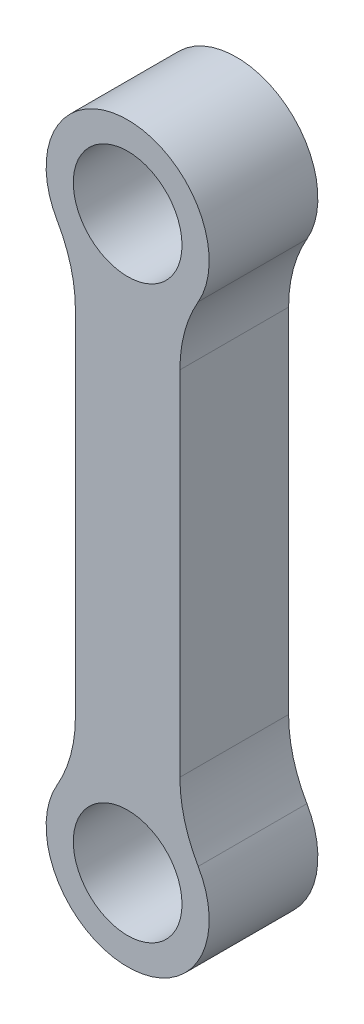
ISO-10303-21;
HEADER;
FILE_DESCRIPTION(('STEP AP214'),'2;1');
FILE_NAME('part.step','',(''),(''),'','','');
FILE_SCHEMA(('AUTOMOTIVE_DESIGN { 1 0 10303 214 1 1 1 1 }'));
ENDSEC;
DATA;
#1=APPLICATION_CONTEXT('core data for automotive mechanical design processes');
#2=APPLICATION_PROTOCOL_DEFINITION('international standard','automotive_design',2000,#1);
#3=PRODUCT_CONTEXT('',#1,'mechanical');
#4=PRODUCT('Part','Part','',(#3));
#5=PRODUCT_RELATED_PRODUCT_CATEGORY('part','',(#4));
#6=PRODUCT_DEFINITION_FORMATION('','',#4);
#7=PRODUCT_DEFINITION_CONTEXT('part definition',#1,'design');
#8=PRODUCT_DEFINITION('design','',#6,#7);
#9=PRODUCT_DEFINITION_SHAPE('','',#8);
#10=(LENGTH_UNIT() NAMED_UNIT(*) SI_UNIT(.MILLI.,.METRE.));
#11=(NAMED_UNIT(*) PLANE_ANGLE_UNIT() SI_UNIT($,.RADIAN.));
#12=(NAMED_UNIT(*) SI_UNIT($,.STERADIAN.) SOLID_ANGLE_UNIT());
#13=UNCERTAINTY_MEASURE_WITH_UNIT(LENGTH_MEASURE(1.E-05),#10,'distance_accuracy_value','');
#14=(GEOMETRIC_REPRESENTATION_CONTEXT(3) GLOBAL_UNCERTAINTY_ASSIGNED_CONTEXT((#13)) GLOBAL_UNIT_ASSIGNED_CONTEXT((#10,
#11,#12)) REPRESENTATION_CONTEXT('',''));
#15=CARTESIAN_POINT('',(0.,0.,0.));
#16=DIRECTION('',(0.,0.,1.));
#17=DIRECTION('',(1.,0.,0.));
#18=AXIS2_PLACEMENT_3D('',#15,#16,#17);
#19=CARTESIAN_POINT('',(0.,0.,0.));
#20=DIRECTION('',(0.,0.,0.999999999999994));
#21=DIRECTION('',(0.999999999999998,0.,0.));
#22=AXIS2_PLACEMENT_3D('',#19,#20,#21);
#23=CYLINDRICAL_SURFACE('',#22,2.);
#24=CARTESIAN_POINT('',(0.,0.,4.));
#25=DIRECTION('',(0.,0.,0.999999999999994));
#26=DIRECTION('',(0.999999999999998,0.,0.));
#27=AXIS2_PLACEMENT_3D('',#24,#25,#26);
#28=CIRCLE('',#27,2.);
#29=CARTESIAN_POINT('',(2.,0.,4.));
#30=VERTEX_POINT('',#29);
#31=EDGE_CURVE('E214',#30,#30,#28,.T.);
#32=CARTESIAN_POINT('',(0.,0.,0.5));
#33=DIRECTION('',(0.,0.,-0.999999999999994));
#34=DIRECTION('',(-0.999999999999998,0.,0.));
#35=AXIS2_PLACEMENT_3D('',#32,#33,#34);
#36=CIRCLE('',#35,2.);
#37=CARTESIAN_POINT('',(2.,0.,0.5));
#38=VERTEX_POINT('',#37);
#39=EDGE_CURVE('E11',#38,#38,#36,.F.);
#40=CARTESIAN_POINT('',(2.,0.,4.));
#41=CARTESIAN_POINT('',(2.,0.,3.96354166666666));
#42=CARTESIAN_POINT('',(2.,0.,3.92708333333333));
#43=CARTESIAN_POINT('',(2.,0.,3.85416666666666));
#44=CARTESIAN_POINT('',(2.,0.,3.81770833333333));
#45=CARTESIAN_POINT('',(2.,0.,3.74479166666666));
#46=CARTESIAN_POINT('',(2.,0.,3.70833333333333));
#47=CARTESIAN_POINT('',(2.,0.,3.63541666666666));
#48=CARTESIAN_POINT('',(2.,0.,3.59895833333333));
#49=CARTESIAN_POINT('',(2.,0.,3.52604166666666));
#50=CARTESIAN_POINT('',(2.,0.,3.48958333333333));
#51=CARTESIAN_POINT('',(2.,0.,3.41666666666666));
#52=CARTESIAN_POINT('',(2.,0.,3.38020833333333));
#53=CARTESIAN_POINT('',(2.,0.,3.30729166666666));
#54=CARTESIAN_POINT('',(2.,0.,3.27083333333333));
#55=CARTESIAN_POINT('',(2.,0.,3.19791666666666));
#56=CARTESIAN_POINT('',(2.,0.,3.16145833333333));
#57=CARTESIAN_POINT('',(2.,0.,3.08854166666666));
#58=CARTESIAN_POINT('',(2.,0.,3.05208333333333));
#59=CARTESIAN_POINT('',(2.,0.,2.97916666666666));
#60=CARTESIAN_POINT('',(2.,0.,2.94270833333333));
#61=CARTESIAN_POINT('',(2.,0.,2.86979166666666));
#62=CARTESIAN_POINT('',(2.,0.,2.83333333333333));
#63=CARTESIAN_POINT('',(2.,0.,2.76041666666666));
#64=CARTESIAN_POINT('',(2.,0.,2.72395833333333));
#65=CARTESIAN_POINT('',(2.,0.,2.65104166666666));
#66=CARTESIAN_POINT('',(2.,0.,2.61458333333333));
#67=CARTESIAN_POINT('',(2.,0.,2.54166666666666));
#68=CARTESIAN_POINT('',(2.,0.,2.50520833333333));
#69=CARTESIAN_POINT('',(2.,0.,2.43229166666666));
#70=CARTESIAN_POINT('',(2.,0.,2.39583333333333));
#71=CARTESIAN_POINT('',(2.,0.,2.32291666666667));
#72=CARTESIAN_POINT('',(2.,0.,2.28645833333333));
#73=CARTESIAN_POINT('',(2.,0.,2.21354166666666));
#74=CARTESIAN_POINT('',(2.,0.,2.17708333333333));
#75=CARTESIAN_POINT('',(2.,0.,2.10416666666667));
#76=CARTESIAN_POINT('',(2.,0.,2.06770833333333));
#77=CARTESIAN_POINT('',(2.,0.,1.99479166666667));
#78=CARTESIAN_POINT('',(2.,0.,1.95833333333333));
#79=CARTESIAN_POINT('',(2.,0.,1.88541666666667));
#80=CARTESIAN_POINT('',(2.,0.,1.84895833333333));
#81=CARTESIAN_POINT('',(2.,0.,1.77604166666667));
#82=CARTESIAN_POINT('',(2.,0.,1.73958333333333));
#83=CARTESIAN_POINT('',(2.,0.,1.66666666666667));
#84=CARTESIAN_POINT('',(2.,0.,1.63020833333333));
#85=CARTESIAN_POINT('',(2.,0.,1.55729166666667));
#86=CARTESIAN_POINT('',(2.,0.,1.52083333333333));
#87=CARTESIAN_POINT('',(2.,0.,1.44791666666667));
#88=CARTESIAN_POINT('',(2.,0.,1.41145833333333));
#89=CARTESIAN_POINT('',(2.,0.,1.33854166666667));
#90=CARTESIAN_POINT('',(2.,0.,1.30208333333333));
#91=CARTESIAN_POINT('',(2.,0.,1.22916666666667));
#92=CARTESIAN_POINT('',(2.,0.,1.19270833333333));
#93=CARTESIAN_POINT('',(2.,0.,1.11979166666667));
#94=CARTESIAN_POINT('',(2.,0.,1.08333333333333));
#95=CARTESIAN_POINT('',(2.,0.,1.01041666666667));
#96=CARTESIAN_POINT('',(2.,0.,0.973958333333333));
#97=CARTESIAN_POINT('',(2.,0.,0.901041666666666));
#98=CARTESIAN_POINT('',(2.,0.,0.864583333333333));
#99=CARTESIAN_POINT('',(2.,0.,0.791666666666667));
#100=CARTESIAN_POINT('',(2.,0.,0.755208333333333));
#101=CARTESIAN_POINT('',(2.,0.,0.682291666666667));
#102=CARTESIAN_POINT('',(2.,0.,0.645833333333333));
#103=CARTESIAN_POINT('',(2.,0.,0.572916666666667));
#104=CARTESIAN_POINT('',(2.,0.,0.536458333333333));
#105=CARTESIAN_POINT('',(2.,0.,0.5));
#106=B_SPLINE_CURVE_WITH_KNOTS('',3,(#40,#41,#42,#43,#44,#45,#46,#47,#48,#49,#50,#51,#52,#53,
#54,#55,#56,#57,#58,#59,#60,#61,#62,#63,#64,#65,#66,#67,#68,#69,#70,#71,#72,#73,#74,#75,#76,#77,
#78,#79,#80,#81,#82,#83,#84,#85,#86,#87,#88,#89,#90,#91,#92,#93,#94,#95,#96,#97,#98,#99,#100,
#101,#102,#103,#104,#105),.UNSPECIFIED.,.F.,.F.,(4,2,2,2,2,2,2,2,2,2,2,2,2,2,2,2,2,2,2,2,2,2,2,
2,2,2,2,2,2,2,2,2,4),(0.,0.109375,0.218749999999999,0.328124999999999,0.437499999999999,
0.546874999999999,0.656249999999999,0.765624999999999,0.874999999999999,0.984374999999998,
1.09375,1.203125,1.3125,1.421875,1.53125,1.640625,1.75,1.859375,1.96875,2.078125,2.1875,
2.296875,2.40625,2.515625,2.625,2.734375,2.84375,2.953125,3.0625,3.171875,3.28125,3.390625,3.5),.UNSPECIFIED.);
#107=EDGE_CURVE('BSEAM36',#30,#38,#106,.T.);
#108=ORIENTED_EDGE('',*,*,#31,.T.);
#109=ORIENTED_EDGE('',*,*,#39,.F.);
#110=ORIENTED_EDGE('',*,*,#107,.T.);
#111=ORIENTED_EDGE('',*,*,#107,.F.);
#112=EDGE_LOOP('',(#108,#110,#109,#111));
#113=FACE_BOUND('',#112,.T.);
#114=ADVANCED_FACE('F36',(#113),#23,.F.);
#115=CARTESIAN_POINT('',(0.,20.9999999999999,0.));
#116=DIRECTION('',(0.,0.,0.999999999999994));
#117=DIRECTION('',(0.999999999999998,0.,0.));
#118=AXIS2_PLACEMENT_3D('',#115,#116,#117);
#119=CYLINDRICAL_SURFACE('',#118,2.);
#120=CARTESIAN_POINT('',(0.,20.9999999999999,4.));
#121=DIRECTION('',(0.,0.,0.999999999999994));
#122=DIRECTION('',(0.999999999999998,0.,0.));
#123=AXIS2_PLACEMENT_3D('',#120,#121,#122);
#124=CIRCLE('',#123,2.);
#125=CARTESIAN_POINT('',(2.,20.9999999999999,4.));
#126=VERTEX_POINT('',#125);
#127=EDGE_CURVE('E230',#126,#126,#124,.T.);
#128=CARTESIAN_POINT('',(0.,20.9999999999999,0.5));
#129=DIRECTION('',(0.,0.,-0.999999999999994));
#130=DIRECTION('',(-0.999999999999998,0.,0.));
#131=AXIS2_PLACEMENT_3D('',#128,#129,#130);
#132=CIRCLE('',#131,2.);
#133=CARTESIAN_POINT('',(2.,20.9999999999999,0.5));
#134=VERTEX_POINT('',#133);
#135=EDGE_CURVE('E44',#134,#134,#132,.F.);
#136=CARTESIAN_POINT('',(2.,20.9999999999999,4.));
#137=CARTESIAN_POINT('',(2.,20.9999999999999,3.96354166666666));
#138=CARTESIAN_POINT('',(2.,20.9999999999999,3.92708333333333));
#139=CARTESIAN_POINT('',(2.,20.9999999999999,3.85416666666666));
#140=CARTESIAN_POINT('',(2.,20.9999999999999,3.81770833333333));
#141=CARTESIAN_POINT('',(2.,20.9999999999999,3.74479166666666));
#142=CARTESIAN_POINT('',(2.,20.9999999999999,3.70833333333333));
#143=CARTESIAN_POINT('',(2.,20.9999999999999,3.63541666666666));
#144=CARTESIAN_POINT('',(2.,20.9999999999999,3.59895833333333));
#145=CARTESIAN_POINT('',(2.,20.9999999999999,3.52604166666666));
#146=CARTESIAN_POINT('',(2.,20.9999999999999,3.48958333333333));
#147=CARTESIAN_POINT('',(2.,20.9999999999999,3.41666666666666));
#148=CARTESIAN_POINT('',(2.,20.9999999999999,3.38020833333333));
#149=CARTESIAN_POINT('',(2.,20.9999999999999,3.30729166666666));
#150=CARTESIAN_POINT('',(2.,20.9999999999999,3.27083333333333));
#151=CARTESIAN_POINT('',(2.,20.9999999999999,3.19791666666666));
#152=CARTESIAN_POINT('',(2.,20.9999999999999,3.16145833333333));
#153=CARTESIAN_POINT('',(2.,20.9999999999999,3.08854166666666));
#154=CARTESIAN_POINT('',(2.,20.9999999999999,3.05208333333333));
#155=CARTESIAN_POINT('',(2.,20.9999999999999,2.97916666666666));
#156=CARTESIAN_POINT('',(2.,20.9999999999999,2.94270833333333));
#157=CARTESIAN_POINT('',(2.,20.9999999999999,2.86979166666666));
#158=CARTESIAN_POINT('',(2.,20.9999999999999,2.83333333333333));
#159=CARTESIAN_POINT('',(2.,20.9999999999999,2.76041666666666));
#160=CARTESIAN_POINT('',(2.,20.9999999999999,2.72395833333333));
#161=CARTESIAN_POINT('',(2.,20.9999999999999,2.65104166666666));
#162=CARTESIAN_POINT('',(2.,20.9999999999999,2.61458333333333));
#163=CARTESIAN_POINT('',(2.,20.9999999999999,2.54166666666666));
#164=CARTESIAN_POINT('',(2.,20.9999999999999,2.50520833333333));
#165=CARTESIAN_POINT('',(2.,20.9999999999999,2.43229166666666));
#166=CARTESIAN_POINT('',(2.,20.9999999999999,2.39583333333333));
#167=CARTESIAN_POINT('',(2.,20.9999999999999,2.32291666666667));
#168=CARTESIAN_POINT('',(2.,20.9999999999999,2.28645833333333));
#169=CARTESIAN_POINT('',(2.,20.9999999999999,2.21354166666666));
#170=CARTESIAN_POINT('',(2.,20.9999999999999,2.17708333333333));
#171=CARTESIAN_POINT('',(2.,20.9999999999999,2.10416666666667));
#172=CARTESIAN_POINT('',(2.,20.9999999999999,2.06770833333333));
#173=CARTESIAN_POINT('',(2.,20.9999999999999,1.99479166666667));
#174=CARTESIAN_POINT('',(2.,20.9999999999999,1.95833333333333));
#175=CARTESIAN_POINT('',(2.,20.9999999999999,1.88541666666667));
#176=CARTESIAN_POINT('',(2.,20.9999999999999,1.84895833333333));
#177=CARTESIAN_POINT('',(2.,20.9999999999999,1.77604166666667));
#178=CARTESIAN_POINT('',(2.,20.9999999999999,1.73958333333333));
#179=CARTESIAN_POINT('',(2.,20.9999999999999,1.66666666666667));
#180=CARTESIAN_POINT('',(2.,20.9999999999999,1.63020833333333));
#181=CARTESIAN_POINT('',(2.,20.9999999999999,1.55729166666667));
#182=CARTESIAN_POINT('',(2.,20.9999999999999,1.52083333333333));
#183=CARTESIAN_POINT('',(2.,20.9999999999999,1.44791666666667));
#184=CARTESIAN_POINT('',(2.,20.9999999999999,1.41145833333333));
#185=CARTESIAN_POINT('',(2.,20.9999999999999,1.33854166666667));
#186=CARTESIAN_POINT('',(2.,20.9999999999999,1.30208333333333));
#187=CARTESIAN_POINT('',(2.,20.9999999999999,1.22916666666667));
#188=CARTESIAN_POINT('',(2.,20.9999999999999,1.19270833333333));
#189=CARTESIAN_POINT('',(2.,20.9999999999999,1.11979166666667));
#190=CARTESIAN_POINT('',(2.,20.9999999999999,1.08333333333333));
#191=CARTESIAN_POINT('',(2.,20.9999999999999,1.01041666666667));
#192=CARTESIAN_POINT('',(2.,20.9999999999999,0.973958333333333));
#193=CARTESIAN_POINT('',(2.,20.9999999999999,0.901041666666666));
#194=CARTESIAN_POINT('',(2.,20.9999999999999,0.864583333333333));
#195=CARTESIAN_POINT('',(2.,20.9999999999999,0.791666666666667));
#196=CARTESIAN_POINT('',(2.,20.9999999999999,0.755208333333333));
#197=CARTESIAN_POINT('',(2.,20.9999999999999,0.682291666666667));
#198=CARTESIAN_POINT('',(2.,20.9999999999999,0.645833333333333));
#199=CARTESIAN_POINT('',(2.,20.9999999999999,0.572916666666667));
#200=CARTESIAN_POINT('',(2.,20.9999999999999,0.536458333333333));
#201=CARTESIAN_POINT('',(2.,20.9999999999999,0.5));
#202=B_SPLINE_CURVE_WITH_KNOTS('',3,(#136,#137,#138,#139,#140,#141,#142,#143,#144,#145,#146,
#147,#148,#149,#150,#151,#152,#153,#154,#155,#156,#157,#158,#159,#160,#161,#162,#163,#164,#165,
#166,#167,#168,#169,#170,#171,#172,#173,#174,#175,#176,#177,#178,#179,#180,#181,#182,#183,#184,
#185,#186,#187,#188,#189,#190,#191,#192,#193,#194,#195,#196,#197,#198,#199,#200,#201),
.UNSPECIFIED.,.F.,.F.,(4,2,2,2,2,2,2,2,2,2,2,2,2,2,2,2,2,2,2,2,2,2,2,2,2,2,2,2,2,2,2,2,4),(0.,
0.109375,0.218749999999999,0.328124999999999,0.437499999999999,0.546874999999999,
0.656249999999999,0.765624999999999,0.874999999999999,0.984374999999998,1.09375,1.203125,1.3125,
1.421875,1.53125,1.640625,1.75,1.859375,1.96875,2.078125,2.1875,2.296875,2.40625,2.515625,2.625,
2.734375,2.84375,2.953125,3.0625,3.171875,3.28125,3.390625,3.5),.UNSPECIFIED.);
#203=EDGE_CURVE('BSEAM161',#126,#134,#202,.T.);
#204=ORIENTED_EDGE('',*,*,#127,.T.);
#205=ORIENTED_EDGE('',*,*,#135,.F.);
#206=ORIENTED_EDGE('',*,*,#203,.T.);
#207=ORIENTED_EDGE('',*,*,#203,.F.);
#208=EDGE_LOOP('',(#204,#206,#205,#207));
#209=FACE_BOUND('',#208,.T.);
#210=ADVANCED_FACE('F161',(#209),#119,.F.);
#211=CARTESIAN_POINT('',(-1.92294335282388,19.,0.));
#212=DIRECTION('',(-0.999999999999998,0.,0.));
#213=DIRECTION('',(0.,0.,0.999999999999994));
#214=AXIS2_PLACEMENT_3D('',#211,#212,#213);
#215=PLANE('',#214);
#216=DIRECTION('',(0.,-0.999999999999998,0.));
#217=VECTOR('',#216,1.);
#218=CARTESIAN_POINT('',(-1.92294335282388,19.,0.));
#219=LINE('',#218,#217);
#220=CARTESIAN_POINT('',(-1.92294335282382,16.9909034267566,0.));
#221=VERTEX_POINT('',#220);
#222=CARTESIAN_POINT('',(-1.92294335282388,4.00909657324332,0.));
#223=VERTEX_POINT('',#222);
#224=EDGE_CURVE('E215',#221,#223,#219,.T.);
#225=ORIENTED_EDGE('',*,*,#224,.T.);
#226=DIRECTION('',(0.,0.,-0.999999999999994));
#227=VECTOR('',#226,1.);
#228=CARTESIAN_POINT('',(-1.92294335282388,4.00909657324332,0.));
#229=LINE('',#228,#227);
#230=CARTESIAN_POINT('',(-1.92294335282388,4.00909657324332,4.));
#231=VERTEX_POINT('',#230);
#232=EDGE_CURVE('E132',#223,#231,#229,.F.);
#233=ORIENTED_EDGE('',*,*,#232,.T.);
#234=DIRECTION('',(0.,-0.999999999999998,0.));
#235=VECTOR('',#234,1.);
#236=CARTESIAN_POINT('',(-1.92294335282388,19.,4.));
#237=LINE('',#236,#235);
#238=CARTESIAN_POINT('',(-1.92294335282382,16.9909034267566,4.));
#239=VERTEX_POINT('',#238);
#240=EDGE_CURVE('E110',#239,#231,#237,.T.);
#241=ORIENTED_EDGE('',*,*,#240,.F.);
#242=DIRECTION('',(0.,0.,-0.999999999999994));
#243=VECTOR('',#242,1.);
#244=CARTESIAN_POINT('',(-1.92294335282382,16.9909034267566,0.));
#245=LINE('',#244,#243);
#246=EDGE_CURVE('E129',#239,#221,#245,.T.);
#247=ORIENTED_EDGE('',*,*,#246,.T.);
#248=EDGE_LOOP('',(#225,#233,#241,#247));
#249=FACE_BOUND('',#248,.T.);
#250=ADVANCED_FACE('F163',(#249),#215,.T.);
#251=CARTESIAN_POINT('',(1.92294335282388,18.9999999999999,0.));
#252=DIRECTION('',(0.999999999999998,0.,0.));
#253=DIRECTION('',(0.,0.,-0.999999999999994));
#254=AXIS2_PLACEMENT_3D('',#251,#252,#253);
#255=PLANE('',#254);
#256=DIRECTION('',(0.,0.999999999999998,0.));
#257=VECTOR('',#256,1.);
#258=CARTESIAN_POINT('',(1.92294335282388,18.9999999999999,4.));
#259=LINE('',#258,#257);
#260=CARTESIAN_POINT('',(1.92294335282395,4.00909657324332,4.));
#261=VERTEX_POINT('',#260);
#262=CARTESIAN_POINT('',(1.92294335282393,16.9909034267566,4.));
#263=VERTEX_POINT('',#262);
#264=EDGE_CURVE('E220',#261,#263,#259,.T.);
#265=ORIENTED_EDGE('',*,*,#264,.F.);
#266=DIRECTION('',(0.,0.,-0.999999999999994));
#267=VECTOR('',#266,1.);
#268=CARTESIAN_POINT('',(1.92294335282395,4.00909657324334,0.));
#269=LINE('',#268,#267);
#270=CARTESIAN_POINT('',(1.92294335282395,4.00909657324334,0.));
#271=VERTEX_POINT('',#270);
#272=EDGE_CURVE('E141',#261,#271,#269,.T.);
#273=ORIENTED_EDGE('',*,*,#272,.T.);
#274=DIRECTION('',(0.,0.999999999999998,0.));
#275=VECTOR('',#274,1.);
#276=CARTESIAN_POINT('',(1.92294335282388,18.9999999999999,0.));
#277=LINE('',#276,#275);
#278=CARTESIAN_POINT('',(1.92294335282387,16.9909034267566,0.));
#279=VERTEX_POINT('',#278);
#280=EDGE_CURVE('E209',#271,#279,#277,.T.);
#281=ORIENTED_EDGE('',*,*,#280,.T.);
#282=DIRECTION('',(0.,0.,-0.999999999999994));
#283=VECTOR('',#282,1.);
#284=CARTESIAN_POINT('',(1.92294335282387,16.9909034267566,0.));
#285=LINE('',#284,#283);
#286=EDGE_CURVE('E138',#279,#263,#285,.F.);
#287=ORIENTED_EDGE('',*,*,#286,.T.);
#288=EDGE_LOOP('',(#265,#273,#281,#287));
#289=FACE_BOUND('',#288,.T.);
#290=ADVANCED_FACE('F170',(#289),#255,.T.);
#291=CARTESIAN_POINT('',(0.,0.,4.));
#292=DIRECTION('',(0.,0.,-0.999999999999994));
#293=DIRECTION('',(-0.999999999999998,0.,0.));
#294=AXIS2_PLACEMENT_3D('',#291,#292,#293);
#295=CYLINDRICAL_SURFACE('',#294,3.);
#296=CARTESIAN_POINT('',(0.,0.,4.));
#297=DIRECTION('',(0.,0.,0.999999999999994));
#298=DIRECTION('',(0.999999999999998,0.,0.));
#299=AXIS2_PLACEMENT_3D('',#296,#297,#298);
#300=CIRCLE('',#299,3.);
#301=CARTESIAN_POINT('',(-2.59610375730893,1.50341121496626,4.));
#302=VERTEX_POINT('',#301);
#303=CARTESIAN_POINT('',(2.59610375730895,1.50341121496626,4.));
#304=VERTEX_POINT('',#303);
#305=EDGE_CURVE('E108',#302,#304,#300,.T.);
#306=ORIENTED_EDGE('',*,*,#305,.F.);
#307=DIRECTION('',(0.,0.,-0.999999999999994));
#308=VECTOR('',#307,1.);
#309=CARTESIAN_POINT('',(-2.59610375730893,1.50341121496626,4.));
#310=LINE('',#309,#308);
#311=CARTESIAN_POINT('',(-2.59610375730893,1.50341121496626,0.));
#312=VERTEX_POINT('',#311);
#313=EDGE_CURVE('E122',#302,#312,#310,.T.);
#314=ORIENTED_EDGE('',*,*,#313,.T.);
#315=CARTESIAN_POINT('',(0.,0.,0.));
#316=DIRECTION('',(0.,0.,0.999999999999994));
#317=DIRECTION('',(0.999999999999998,0.,0.));
#318=AXIS2_PLACEMENT_3D('',#315,#316,#317);
#319=CIRCLE('',#318,3.);
#320=CARTESIAN_POINT('',(2.59610375730895,1.50341121496626,0.));
#321=VERTEX_POINT('',#320);
#322=EDGE_CURVE('E126',#312,#321,#319,.T.);
#323=ORIENTED_EDGE('',*,*,#322,.T.);
#324=DIRECTION('',(0.,0.,-0.999999999999994));
#325=VECTOR('',#324,1.);
#326=CARTESIAN_POINT('',(2.59610375730895,1.50341121496626,4.));
#327=LINE('',#326,#325);
#328=EDGE_CURVE('E125',#321,#304,#327,.F.);
#329=ORIENTED_EDGE('',*,*,#328,.T.);
#330=EDGE_LOOP('',(#306,#314,#323,#329));
#331=FACE_BOUND('',#330,.T.);
#332=ADVANCED_FACE('F120',(#331),#295,.T.);
#333=CARTESIAN_POINT('',(0.,0.,4.));
#334=DIRECTION('',(0.,0.,0.999999999999994));
#335=DIRECTION('',(0.999999999999998,0.,0.));
#336=AXIS2_PLACEMENT_3D('',#333,#334,#335);
#337=PLANE('',#336);
#338=ORIENTED_EDGE('',*,*,#264,.T.);
#339=CARTESIAN_POINT('',(6.92294335282388,16.9909034267567,4.));
#340=DIRECTION('',(0.,0.,0.999999999999994));
#341=DIRECTION('',(0.999999999999998,0.,0.));
#342=AXIS2_PLACEMENT_3D('',#339,#340,#341);
#343=CIRCLE('',#342,5.);
#344=CARTESIAN_POINT('',(2.59610375730898,19.4965887850337,4.));
#345=VERTEX_POINT('',#344);
#346=EDGE_CURVE('E150',#263,#345,#343,.F.);
#347=ORIENTED_EDGE('',*,*,#346,.T.);
#348=CARTESIAN_POINT('',(0.,20.9999999999999,4.));
#349=DIRECTION('',(0.,0.,0.999999999999994));
#350=DIRECTION('',(0.999999999999998,0.,0.));
#351=AXIS2_PLACEMENT_3D('',#348,#349,#350);
#352=CIRCLE('',#351,3.);
#353=CARTESIAN_POINT('',(-2.59610375730895,19.4965887850336,4.));
#354=VERTEX_POINT('',#353);
#355=EDGE_CURVE('E225',#345,#354,#352,.T.);
#356=ORIENTED_EDGE('',*,*,#355,.T.);
#357=CARTESIAN_POINT('',(-6.92294335282388,16.9909034267566,4.));
#358=DIRECTION('',(0.,0.,0.999999999999994));
#359=DIRECTION('',(0.999999999999998,0.,0.));
#360=AXIS2_PLACEMENT_3D('',#357,#358,#359);
#361=CIRCLE('',#360,5.);
#362=EDGE_CURVE('E155',#354,#239,#361,.F.);
#363=ORIENTED_EDGE('',*,*,#362,.T.);
#364=ORIENTED_EDGE('',*,*,#240,.T.);
#365=CARTESIAN_POINT('',(-6.92294335282379,4.00909657324334,4.));
#366=DIRECTION('',(0.,0.,0.999999999999994));
#367=DIRECTION('',(0.999999999999998,0.,0.));
#368=AXIS2_PLACEMENT_3D('',#365,#366,#367);
#369=CIRCLE('',#368,5.);
#370=EDGE_CURVE('E103',#231,#302,#369,.F.);
#371=ORIENTED_EDGE('',*,*,#370,.T.);
#372=ORIENTED_EDGE('',*,*,#305,.T.);
#373=CARTESIAN_POINT('',(6.92294335282385,4.00909657324334,4.));
#374=DIRECTION('',(0.,0.,0.999999999999994));
#375=DIRECTION('',(0.999999999999998,0.,0.));
#376=AXIS2_PLACEMENT_3D('',#373,#374,#375);
#377=CIRCLE('',#376,5.);
#378=EDGE_CURVE('E114',#304,#261,#377,.F.);
#379=ORIENTED_EDGE('',*,*,#378,.T.);
#380=EDGE_LOOP('',(#338,#347,#356,#363,#364,#371,#372,#379));
#381=FACE_BOUND('',#380,.T.);
#382=ORIENTED_EDGE('',*,*,#127,.F.);
#383=EDGE_LOOP('',(#382));
#384=FACE_BOUND('',#383,.T.);
#385=ORIENTED_EDGE('',*,*,#31,.F.);
#386=EDGE_LOOP('',(#385));
#387=FACE_BOUND('',#386,.T.);
#388=ADVANCED_FACE('F106',(#381,#384,#387),#337,.T.);
#389=CARTESIAN_POINT('',(0.,0.,0.));
#390=DIRECTION('',(0.,0.,0.999999999999994));
#391=DIRECTION('',(0.999999999999998,0.,0.));
#392=AXIS2_PLACEMENT_3D('',#389,#390,#391);
#393=PLANE('',#392);
#394=CARTESIAN_POINT('',(0.,0.,0.));
#395=DIRECTION('',(0.,0.,0.999999999999994));
#396=DIRECTION('',(0.999999999999998,0.,0.));
#397=AXIS2_PLACEMENT_3D('',#394,#395,#396);
#398=CIRCLE('',#397,1.5);
#399=CARTESIAN_POINT('',(1.5,0.,0.));
#400=VERTEX_POINT('',#399);
#401=EDGE_CURVE('E237',#400,#400,#398,.T.);
#402=ORIENTED_EDGE('',*,*,#401,.T.);
#403=EDGE_LOOP('',(#402));
#404=FACE_BOUND('',#403,.T.);
#405=CARTESIAN_POINT('',(0.,20.9999999999999,0.));
#406=DIRECTION('',(0.,0.,0.999999999999994));
#407=DIRECTION('',(0.999999999999998,0.,0.));
#408=AXIS2_PLACEMENT_3D('',#405,#406,#407);
#409=CIRCLE('',#408,1.5);
#410=CARTESIAN_POINT('',(1.5,20.9999999999999,0.));
#411=VERTEX_POINT('',#410);
#412=EDGE_CURVE('E233',#411,#411,#409,.T.);
#413=ORIENTED_EDGE('',*,*,#412,.T.);
#414=EDGE_LOOP('',(#413));
#415=FACE_BOUND('',#414,.T.);
#416=CARTESIAN_POINT('',(0.,20.9999999999999,0.));
#417=DIRECTION('',(0.,0.,0.999999999999994));
#418=DIRECTION('',(0.999999999999998,0.,0.));
#419=AXIS2_PLACEMENT_3D('',#416,#417,#418);
#420=CIRCLE('',#419,3.);
#421=CARTESIAN_POINT('',(2.59610375730898,19.4965887850337,0.));
#422=VERTEX_POINT('',#421);
#423=CARTESIAN_POINT('',(-2.59610375730895,19.4965887850336,0.));
#424=VERTEX_POINT('',#423);
#425=EDGE_CURVE('E211',#422,#424,#420,.T.);
#426=ORIENTED_EDGE('',*,*,#425,.F.);
#427=CARTESIAN_POINT('',(6.92294335282388,16.9909034267567,0.));
#428=DIRECTION('',(0.,0.,0.999999999999994));
#429=DIRECTION('',(0.999999999999998,0.,0.));
#430=AXIS2_PLACEMENT_3D('',#427,#428,#429);
#431=CIRCLE('',#430,5.);
#432=EDGE_CURVE('E152',#422,#279,#431,.T.);
#433=ORIENTED_EDGE('',*,*,#432,.T.);
#434=ORIENTED_EDGE('',*,*,#280,.F.);
#435=CARTESIAN_POINT('',(6.92294335282385,4.00909657324334,0.));
#436=DIRECTION('',(0.,0.,0.999999999999994));
#437=DIRECTION('',(0.999999999999998,0.,0.));
#438=AXIS2_PLACEMENT_3D('',#435,#436,#437);
#439=CIRCLE('',#438,5.);
#440=EDGE_CURVE('E148',#271,#321,#439,.T.);
#441=ORIENTED_EDGE('',*,*,#440,.T.);
#442=ORIENTED_EDGE('',*,*,#322,.F.);
#443=CARTESIAN_POINT('',(-6.92294335282379,4.00909657324334,0.));
#444=DIRECTION('',(0.,0.,0.999999999999994));
#445=DIRECTION('',(0.999999999999998,0.,0.));
#446=AXIS2_PLACEMENT_3D('',#443,#444,#445);
#447=CIRCLE('',#446,5.);
#448=EDGE_CURVE('E115',#312,#223,#447,.T.);
#449=ORIENTED_EDGE('',*,*,#448,.T.);
#450=ORIENTED_EDGE('',*,*,#224,.F.);
#451=CARTESIAN_POINT('',(-6.92294335282388,16.9909034267566,0.));
#452=DIRECTION('',(0.,0.,0.999999999999994));
#453=DIRECTION('',(0.999999999999998,0.,0.));
#454=AXIS2_PLACEMENT_3D('',#451,#452,#453);
#455=CIRCLE('',#454,5.);
#456=EDGE_CURVE('E51',#221,#424,#455,.T.);
#457=ORIENTED_EDGE('',*,*,#456,.T.);
#458=EDGE_LOOP('',(#426,#433,#434,#441,#442,#449,#450,#457));
#459=FACE_BOUND('',#458,.T.);
#460=ADVANCED_FACE('F182',(#404,#415,#459),#393,.F.);
#461=CARTESIAN_POINT('',(0.,20.9999999999999,4.));
#462=DIRECTION('',(0.,0.,-0.999999999999994));
#463=DIRECTION('',(-0.999999999999998,0.,0.));
#464=AXIS2_PLACEMENT_3D('',#461,#462,#463);
#465=CYLINDRICAL_SURFACE('',#464,3.);
#466=ORIENTED_EDGE('',*,*,#355,.F.);
#467=DIRECTION('',(0.,0.,-0.999999999999994));
#468=VECTOR('',#467,1.);
#469=CARTESIAN_POINT('',(2.59610375730898,19.4965887850337,4.));
#470=LINE('',#469,#468);
#471=EDGE_CURVE('E58',#345,#422,#470,.T.);
#472=ORIENTED_EDGE('',*,*,#471,.T.);
#473=ORIENTED_EDGE('',*,*,#425,.T.);
#474=DIRECTION('',(0.,0.,-0.999999999999994));
#475=VECTOR('',#474,1.);
#476=CARTESIAN_POINT('',(-2.59610375730895,19.4965887850336,4.));
#477=LINE('',#476,#475);
#478=EDGE_CURVE('E143',#424,#354,#477,.F.);
#479=ORIENTED_EDGE('',*,*,#478,.T.);
#480=EDGE_LOOP('',(#466,#472,#473,#479));
#481=FACE_BOUND('',#480,.T.);
#482=ADVANCED_FACE('F179',(#481),#465,.T.);
#483=CARTESIAN_POINT('',(-6.92294335282379,4.00909657324334,4.));
#484=DIRECTION('',(0.,0.,-0.999999999999994));
#485=DIRECTION('',(-0.999999999999998,0.,0.));
#486=AXIS2_PLACEMENT_3D('',#483,#484,#485);
#487=CYLINDRICAL_SURFACE('',#486,5.);
#488=ORIENTED_EDGE('',*,*,#370,.F.);
#489=ORIENTED_EDGE('',*,*,#232,.F.);
#490=ORIENTED_EDGE('',*,*,#448,.F.);
#491=ORIENTED_EDGE('',*,*,#313,.F.);
#492=EDGE_LOOP('',(#488,#489,#490,#491));
#493=FACE_BOUND('',#492,.T.);
#494=ADVANCED_FACE('F128',(#493),#487,.F.);
#495=CARTESIAN_POINT('',(6.92294335282385,4.00909657324334,4.));
#496=DIRECTION('',(0.,0.,-0.999999999999994));
#497=DIRECTION('',(-0.999999999999998,0.,0.));
#498=AXIS2_PLACEMENT_3D('',#495,#496,#497);
#499=CYLINDRICAL_SURFACE('',#498,5.);
#500=ORIENTED_EDGE('',*,*,#440,.F.);
#501=ORIENTED_EDGE('',*,*,#272,.F.);
#502=ORIENTED_EDGE('',*,*,#378,.F.);
#503=ORIENTED_EDGE('',*,*,#328,.F.);
#504=EDGE_LOOP('',(#500,#501,#502,#503));
#505=FACE_BOUND('',#504,.T.);
#506=ADVANCED_FACE('F195',(#505),#499,.F.);
#507=CARTESIAN_POINT('',(6.92294335282388,16.9909034267567,4.));
#508=DIRECTION('',(0.,0.,-0.999999999999994));
#509=DIRECTION('',(-0.999999999999998,0.,0.));
#510=AXIS2_PLACEMENT_3D('',#507,#508,#509);
#511=CYLINDRICAL_SURFACE('',#510,5.);
#512=ORIENTED_EDGE('',*,*,#432,.F.);
#513=ORIENTED_EDGE('',*,*,#471,.F.);
#514=ORIENTED_EDGE('',*,*,#346,.F.);
#515=ORIENTED_EDGE('',*,*,#286,.F.);
#516=EDGE_LOOP('',(#512,#513,#514,#515));
#517=FACE_BOUND('',#516,.T.);
#518=ADVANCED_FACE('F197',(#517),#511,.F.);
#519=CARTESIAN_POINT('',(-6.92294335282388,16.9909034267566,4.));
#520=DIRECTION('',(0.,0.,-0.999999999999994));
#521=DIRECTION('',(-0.999999999999998,0.,0.));
#522=AXIS2_PLACEMENT_3D('',#519,#520,#521);
#523=CYLINDRICAL_SURFACE('',#522,5.);
#524=ORIENTED_EDGE('',*,*,#362,.F.);
#525=ORIENTED_EDGE('',*,*,#478,.F.);
#526=ORIENTED_EDGE('',*,*,#456,.F.);
#527=ORIENTED_EDGE('',*,*,#246,.F.);
#528=EDGE_LOOP('',(#524,#525,#526,#527));
#529=FACE_BOUND('',#528,.T.);
#530=ADVANCED_FACE('F38',(#529),#523,.F.);
#531=CARTESIAN_POINT('',(0.,20.9999999999999,0.5));
#532=DIRECTION('',(0.,0.,-0.999999999999994));
#533=DIRECTION('',(-0.999999999999998,0.,0.));
#534=AXIS2_PLACEMENT_3D('',#531,#532,#533);
#535=PLANE('',#534);
#536=CARTESIAN_POINT('',(0.,20.9999999999999,0.5));
#537=DIRECTION('',(0.,0.,0.999999999999994));
#538=DIRECTION('',(0.999999999999998,0.,0.));
#539=AXIS2_PLACEMENT_3D('',#536,#537,#538);
#540=CIRCLE('',#539,1.5);
#541=CARTESIAN_POINT('',(1.5,20.9999999999999,0.5));
#542=VERTEX_POINT('',#541);
#543=EDGE_CURVE('E234',#542,#542,#540,.T.);
#544=ORIENTED_EDGE('',*,*,#543,.F.);
#545=EDGE_LOOP('',(#544));
#546=FACE_BOUND('',#545,.T.);
#547=ORIENTED_EDGE('',*,*,#135,.T.);
#548=EDGE_LOOP('',(#547));
#549=FACE_BOUND('',#548,.T.);
#550=ADVANCED_FACE('F159',(#546,#549),#535,.F.);
#551=CARTESIAN_POINT('',(0.,20.9999999999999,0.));
#552=DIRECTION('',(0.,0.,0.999999999999994));
#553=DIRECTION('',(0.999999999999998,0.,0.));
#554=AXIS2_PLACEMENT_3D('',#551,#552,#553);
#555=CYLINDRICAL_SURFACE('',#554,1.5);
#556=CARTESIAN_POINT('',(1.5,20.9999999999999,0.));
#557=CARTESIAN_POINT('',(1.5,20.9999999999999,0.00520833333333334));
#558=CARTESIAN_POINT('',(1.5,20.9999999999999,0.0104166666666667));
#559=CARTESIAN_POINT('',(1.5,20.9999999999999,0.0208333333333333));
#560=CARTESIAN_POINT('',(1.5,20.9999999999999,0.0260416666666667));
#561=CARTESIAN_POINT('',(1.5,20.9999999999999,0.0364583333333334));
#562=CARTESIAN_POINT('',(1.5,20.9999999999999,0.0416666666666667));
#563=CARTESIAN_POINT('',(1.5,20.9999999999999,0.0520833333333334));
#564=CARTESIAN_POINT('',(1.5,20.9999999999999,0.0572916666666667));
#565=CARTESIAN_POINT('',(1.5,20.9999999999999,0.0677083333333334));
#566=CARTESIAN_POINT('',(1.5,20.9999999999999,0.0729166666666667));
#567=CARTESIAN_POINT('',(1.5,20.9999999999999,0.0833333333333334));
#568=CARTESIAN_POINT('',(1.5,20.9999999999999,0.0885416666666667));
#569=CARTESIAN_POINT('',(1.5,20.9999999999999,0.0989583333333334));
#570=CARTESIAN_POINT('',(1.5,20.9999999999999,0.104166666666667));
#571=CARTESIAN_POINT('',(1.5,20.9999999999999,0.114583333333333));
#572=CARTESIAN_POINT('',(1.5,20.9999999999999,0.119791666666667));
#573=CARTESIAN_POINT('',(1.5,20.9999999999999,0.130208333333333));
#574=CARTESIAN_POINT('',(1.5,20.9999999999999,0.135416666666667));
#575=CARTESIAN_POINT('',(1.5,20.9999999999999,0.145833333333333));
#576=CARTESIAN_POINT('',(1.5,20.9999999999999,0.151041666666667));
#577=CARTESIAN_POINT('',(1.5,20.9999999999999,0.161458333333333));
#578=CARTESIAN_POINT('',(1.5,20.9999999999999,0.166666666666667));
#579=CARTESIAN_POINT('',(1.5,20.9999999999999,0.177083333333333));
#580=CARTESIAN_POINT('',(1.5,20.9999999999999,0.182291666666667));
#581=CARTESIAN_POINT('',(1.5,20.9999999999999,0.192708333333333));
#582=CARTESIAN_POINT('',(1.5,20.9999999999999,0.197916666666667));
#583=CARTESIAN_POINT('',(1.5,20.9999999999999,0.208333333333333));
#584=CARTESIAN_POINT('',(1.5,20.9999999999999,0.213541666666667));
#585=CARTESIAN_POINT('',(1.5,20.9999999999999,0.223958333333334));
#586=CARTESIAN_POINT('',(1.5,20.9999999999999,0.229166666666667));
#587=CARTESIAN_POINT('',(1.5,20.9999999999999,0.239583333333334));
#588=CARTESIAN_POINT('',(1.5,20.9999999999999,0.244791666666667));
#589=CARTESIAN_POINT('',(1.5,20.9999999999999,0.255208333333334));
#590=CARTESIAN_POINT('',(1.5,20.9999999999999,0.260416666666667));
#591=CARTESIAN_POINT('',(1.5,20.9999999999999,0.270833333333334));
#592=CARTESIAN_POINT('',(1.5,20.9999999999999,0.276041666666667));
#593=CARTESIAN_POINT('',(1.5,20.9999999999999,0.286458333333334));
#594=CARTESIAN_POINT('',(1.5,20.9999999999999,0.291666666666667));
#595=CARTESIAN_POINT('',(1.5,20.9999999999999,0.302083333333334));
#596=CARTESIAN_POINT('',(1.5,20.9999999999999,0.307291666666667));
#597=CARTESIAN_POINT('',(1.5,20.9999999999999,0.317708333333334));
#598=CARTESIAN_POINT('',(1.5,20.9999999999999,0.322916666666667));
#599=CARTESIAN_POINT('',(1.5,20.9999999999999,0.333333333333334));
#600=CARTESIAN_POINT('',(1.5,20.9999999999999,0.338541666666667));
#601=CARTESIAN_POINT('',(1.5,20.9999999999999,0.348958333333334));
#602=CARTESIAN_POINT('',(1.5,20.9999999999999,0.354166666666667));
#603=CARTESIAN_POINT('',(1.5,20.9999999999999,0.364583333333334));
#604=CARTESIAN_POINT('',(1.5,20.9999999999999,0.369791666666667));
#605=CARTESIAN_POINT('',(1.5,20.9999999999999,0.380208333333334));
#606=CARTESIAN_POINT('',(1.5,20.9999999999999,0.385416666666667));
#607=CARTESIAN_POINT('',(1.5,20.9999999999999,0.395833333333334));
#608=CARTESIAN_POINT('',(1.5,20.9999999999999,0.401041666666667));
#609=CARTESIAN_POINT('',(1.5,20.9999999999999,0.411458333333334));
#610=CARTESIAN_POINT('',(1.5,20.9999999999999,0.416666666666667));
#611=CARTESIAN_POINT('',(1.5,20.9999999999999,0.427083333333334));
#612=CARTESIAN_POINT('',(1.5,20.9999999999999,0.432291666666667));
#613=CARTESIAN_POINT('',(1.5,20.9999999999999,0.442708333333334));
#614=CARTESIAN_POINT('',(1.5,20.9999999999999,0.447916666666667));
#615=CARTESIAN_POINT('',(1.5,20.9999999999999,0.458333333333334));
#616=CARTESIAN_POINT('',(1.5,20.9999999999999,0.463541666666667));
#617=CARTESIAN_POINT('',(1.5,20.9999999999999,0.473958333333334));
#618=CARTESIAN_POINT('',(1.5,20.9999999999999,0.479166666666667));
#619=CARTESIAN_POINT('',(1.5,20.9999999999999,0.489583333333334));
#620=CARTESIAN_POINT('',(1.5,20.9999999999999,0.494791666666667));
#621=CARTESIAN_POINT('',(1.5,20.9999999999999,0.5));
#622=B_SPLINE_CURVE_WITH_KNOTS('',3,(#556,#557,#558,#559,#560,#561,#562,#563,#564,#565,#566,
#567,#568,#569,#570,#571,#572,#573,#574,#575,#576,#577,#578,#579,#580,#581,#582,#583,#584,#585,
#586,#587,#588,#589,#590,#591,#592,#593,#594,#595,#596,#597,#598,#599,#600,#601,#602,#603,#604,
#605,#606,#607,#608,#609,#610,#611,#612,#613,#614,#615,#616,#617,#618,#619,#620,#621),
.UNSPECIFIED.,.F.,.F.,(4,2,2,2,2,2,2,2,2,2,2,2,2,2,2,2,2,2,2,2,2,2,2,2,2,2,2,2,2,2,2,2,4),(0.,
0.015625,0.03125,0.046875,0.0625,0.0781250000000001,0.0937500000000001,0.109375,0.125,0.140625,
0.15625,0.171875,0.1875,0.203125,0.21875,0.234375,0.25,0.265625,0.28125,0.296875,0.3125,
0.328125,0.34375,0.359375,0.375,0.390625,0.40625,0.421875,0.4375,0.453125,0.46875,0.484375,0.5),.UNSPECIFIED.);
#623=EDGE_CURVE('BSEAM256',#411,#542,#622,.T.);
#624=ORIENTED_EDGE('',*,*,#412,.F.);
#625=ORIENTED_EDGE('',*,*,#543,.T.);
#626=ORIENTED_EDGE('',*,*,#623,.T.);
#627=ORIENTED_EDGE('',*,*,#623,.F.);
#628=EDGE_LOOP('',(#624,#626,#625,#627));
#629=FACE_BOUND('',#628,.T.);
#630=ADVANCED_FACE('F256',(#629),#555,.F.);
#631=CARTESIAN_POINT('',(0.,0.,0.5));
#632=DIRECTION('',(0.,0.,-0.999999999999994));
#633=DIRECTION('',(-0.999999999999998,0.,0.));
#634=AXIS2_PLACEMENT_3D('',#631,#632,#633);
#635=PLANE('',#634);
#636=CARTESIAN_POINT('',(0.,0.,0.5));
#637=DIRECTION('',(0.,0.,0.999999999999994));
#638=DIRECTION('',(0.999999999999998,0.,0.));
#639=AXIS2_PLACEMENT_3D('',#636,#637,#638);
#640=CIRCLE('',#639,1.5);
#641=CARTESIAN_POINT('',(1.5,0.,0.5));
#642=VERTEX_POINT('',#641);
#643=EDGE_CURVE('E240',#642,#642,#640,.T.);
#644=ORIENTED_EDGE('',*,*,#643,.F.);
#645=EDGE_LOOP('',(#644));
#646=FACE_BOUND('',#645,.T.);
#647=ORIENTED_EDGE('',*,*,#39,.T.);
#648=EDGE_LOOP('',(#647));
#649=FACE_BOUND('',#648,.T.);
#650=ADVANCED_FACE('F250',(#646,#649),#635,.F.);
#651=CARTESIAN_POINT('',(0.,0.,0.));
#652=DIRECTION('',(0.,0.,0.999999999999994));
#653=DIRECTION('',(0.999999999999998,0.,0.));
#654=AXIS2_PLACEMENT_3D('',#651,#652,#653);
#655=CYLINDRICAL_SURFACE('',#654,1.5);
#656=CARTESIAN_POINT('',(1.5,0.,0.));
#657=CARTESIAN_POINT('',(1.5,0.,0.00520833333333334));
#658=CARTESIAN_POINT('',(1.5,0.,0.0104166666666667));
#659=CARTESIAN_POINT('',(1.5,0.,0.0208333333333333));
#660=CARTESIAN_POINT('',(1.5,0.,0.0260416666666667));
#661=CARTESIAN_POINT('',(1.5,0.,0.0364583333333334));
#662=CARTESIAN_POINT('',(1.5,0.,0.0416666666666667));
#663=CARTESIAN_POINT('',(1.5,0.,0.0520833333333334));
#664=CARTESIAN_POINT('',(1.5,0.,0.0572916666666667));
#665=CARTESIAN_POINT('',(1.5,0.,0.0677083333333334));
#666=CARTESIAN_POINT('',(1.5,0.,0.0729166666666667));
#667=CARTESIAN_POINT('',(1.5,0.,0.0833333333333334));
#668=CARTESIAN_POINT('',(1.5,0.,0.0885416666666667));
#669=CARTESIAN_POINT('',(1.5,0.,0.0989583333333334));
#670=CARTESIAN_POINT('',(1.5,0.,0.104166666666667));
#671=CARTESIAN_POINT('',(1.5,0.,0.114583333333333));
#672=CARTESIAN_POINT('',(1.5,0.,0.119791666666667));
#673=CARTESIAN_POINT('',(1.5,0.,0.130208333333333));
#674=CARTESIAN_POINT('',(1.5,0.,0.135416666666667));
#675=CARTESIAN_POINT('',(1.5,0.,0.145833333333333));
#676=CARTESIAN_POINT('',(1.5,0.,0.151041666666667));
#677=CARTESIAN_POINT('',(1.5,0.,0.161458333333333));
#678=CARTESIAN_POINT('',(1.5,0.,0.166666666666667));
#679=CARTESIAN_POINT('',(1.5,0.,0.177083333333333));
#680=CARTESIAN_POINT('',(1.5,0.,0.182291666666667));
#681=CARTESIAN_POINT('',(1.5,0.,0.192708333333333));
#682=CARTESIAN_POINT('',(1.5,0.,0.197916666666667));
#683=CARTESIAN_POINT('',(1.5,0.,0.208333333333333));
#684=CARTESIAN_POINT('',(1.5,0.,0.213541666666667));
#685=CARTESIAN_POINT('',(1.5,0.,0.223958333333334));
#686=CARTESIAN_POINT('',(1.5,0.,0.229166666666667));
#687=CARTESIAN_POINT('',(1.5,0.,0.239583333333334));
#688=CARTESIAN_POINT('',(1.5,0.,0.244791666666667));
#689=CARTESIAN_POINT('',(1.5,0.,0.255208333333334));
#690=CARTESIAN_POINT('',(1.5,0.,0.260416666666667));
#691=CARTESIAN_POINT('',(1.5,0.,0.270833333333334));
#692=CARTESIAN_POINT('',(1.5,0.,0.276041666666667));
#693=CARTESIAN_POINT('',(1.5,0.,0.286458333333334));
#694=CARTESIAN_POINT('',(1.5,0.,0.291666666666667));
#695=CARTESIAN_POINT('',(1.5,0.,0.302083333333334));
#696=CARTESIAN_POINT('',(1.5,0.,0.307291666666667));
#697=CARTESIAN_POINT('',(1.5,0.,0.317708333333334));
#698=CARTESIAN_POINT('',(1.5,0.,0.322916666666667));
#699=CARTESIAN_POINT('',(1.5,0.,0.333333333333334));
#700=CARTESIAN_POINT('',(1.5,0.,0.338541666666667));
#701=CARTESIAN_POINT('',(1.5,0.,0.348958333333334));
#702=CARTESIAN_POINT('',(1.5,0.,0.354166666666667));
#703=CARTESIAN_POINT('',(1.5,0.,0.364583333333334));
#704=CARTESIAN_POINT('',(1.5,0.,0.369791666666667));
#705=CARTESIAN_POINT('',(1.5,0.,0.380208333333334));
#706=CARTESIAN_POINT('',(1.5,0.,0.385416666666667));
#707=CARTESIAN_POINT('',(1.5,0.,0.395833333333334));
#708=CARTESIAN_POINT('',(1.5,0.,0.401041666666667));
#709=CARTESIAN_POINT('',(1.5,0.,0.411458333333334));
#710=CARTESIAN_POINT('',(1.5,0.,0.416666666666667));
#711=CARTESIAN_POINT('',(1.5,0.,0.427083333333334));
#712=CARTESIAN_POINT('',(1.5,0.,0.432291666666667));
#713=CARTESIAN_POINT('',(1.5,0.,0.442708333333334));
#714=CARTESIAN_POINT('',(1.5,0.,0.447916666666667));
#715=CARTESIAN_POINT('',(1.5,0.,0.458333333333334));
#716=CARTESIAN_POINT('',(1.5,0.,0.463541666666667));
#717=CARTESIAN_POINT('',(1.5,0.,0.473958333333334));
#718=CARTESIAN_POINT('',(1.5,0.,0.479166666666667));
#719=CARTESIAN_POINT('',(1.5,0.,0.489583333333334));
#720=CARTESIAN_POINT('',(1.5,0.,0.494791666666667));
#721=CARTESIAN_POINT('',(1.5,0.,0.5));
#722=B_SPLINE_CURVE_WITH_KNOTS('',3,(#656,#657,#658,#659,#660,#661,#662,#663,#664,#665,#666,
#667,#668,#669,#670,#671,#672,#673,#674,#675,#676,#677,#678,#679,#680,#681,#682,#683,#684,#685,
#686,#687,#688,#689,#690,#691,#692,#693,#694,#695,#696,#697,#698,#699,#700,#701,#702,#703,#704,
#705,#706,#707,#708,#709,#710,#711,#712,#713,#714,#715,#716,#717,#718,#719,#720,#721),
.UNSPECIFIED.,.F.,.F.,(4,2,2,2,2,2,2,2,2,2,2,2,2,2,2,2,2,2,2,2,2,2,2,2,2,2,2,2,2,2,2,2,4),(0.,
0.015625,0.03125,0.046875,0.0625,0.0781250000000001,0.0937500000000001,0.109375,0.125,0.140625,
0.15625,0.171875,0.1875,0.203125,0.21875,0.234375,0.25,0.265625,0.28125,0.296875,0.3125,
0.328125,0.34375,0.359375,0.375,0.390625,0.40625,0.421875,0.4375,0.453125,0.46875,0.484375,0.5),.UNSPECIFIED.);
#723=EDGE_CURVE('BSEAM247',#400,#642,#722,.T.);
#724=ORIENTED_EDGE('',*,*,#401,.F.);
#725=ORIENTED_EDGE('',*,*,#643,.T.);
#726=ORIENTED_EDGE('',*,*,#723,.T.);
#727=ORIENTED_EDGE('',*,*,#723,.F.);
#728=EDGE_LOOP('',(#724,#726,#725,#727));
#729=FACE_BOUND('',#728,.T.);
#730=ADVANCED_FACE('F247',(#729),#655,.F.);
#731=CLOSED_SHELL('',(#114,#210,#250,#290,#332,#388,#460,#482,#494,#506,#518,#530,#550,#630,
#650,#730));
#732=MANIFOLD_SOLID_BREP('B2',#731);
#733=ADVANCED_BREP_SHAPE_REPRESENTATION('',(#18,#732),#14);
#734=SHAPE_DEFINITION_REPRESENTATION(#9,#733);
ENDSEC;
END-ISO-10303-21;
